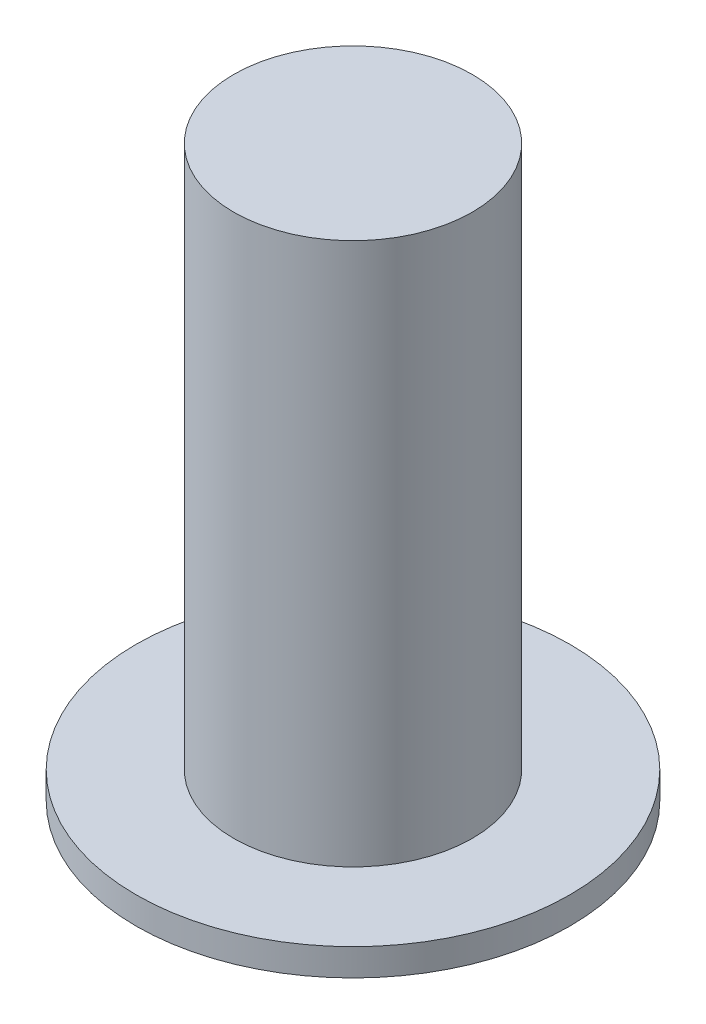
ISO-10303-21;
HEADER;
FILE_DESCRIPTION(('STEP AP214'),'2;1');
FILE_NAME('part.step','',(''),(''),'','','');
FILE_SCHEMA(('AUTOMOTIVE_DESIGN { 1 0 10303 214 1 1 1 1 }'));
ENDSEC;
DATA;
#1=APPLICATION_CONTEXT('core data for automotive mechanical design processes');
#2=APPLICATION_PROTOCOL_DEFINITION('international standard','automotive_design',2000,#1);
#3=PRODUCT_CONTEXT('',#1,'mechanical');
#4=PRODUCT('Part','Part','',(#3));
#5=PRODUCT_RELATED_PRODUCT_CATEGORY('part','',(#4));
#6=PRODUCT_DEFINITION_FORMATION('','',#4);
#7=PRODUCT_DEFINITION_CONTEXT('part definition',#1,'design');
#8=PRODUCT_DEFINITION('design','',#6,#7);
#9=PRODUCT_DEFINITION_SHAPE('','',#8);
#10=(LENGTH_UNIT() NAMED_UNIT(*) SI_UNIT(.MILLI.,.METRE.));
#11=(NAMED_UNIT(*) PLANE_ANGLE_UNIT() SI_UNIT($,.RADIAN.));
#12=(NAMED_UNIT(*) SI_UNIT($,.STERADIAN.) SOLID_ANGLE_UNIT());
#13=UNCERTAINTY_MEASURE_WITH_UNIT(LENGTH_MEASURE(1.E-05),#10,'distance_accuracy_value','');
#14=(GEOMETRIC_REPRESENTATION_CONTEXT(3) GLOBAL_UNCERTAINTY_ASSIGNED_CONTEXT((#13)) GLOBAL_UNIT_ASSIGNED_CONTEXT((#10,
#11,#12)) REPRESENTATION_CONTEXT('',''));
#15=CARTESIAN_POINT('',(0.,0.,0.));
#16=DIRECTION('',(0.,0.,1.));
#17=DIRECTION('',(1.,0.,0.));
#18=AXIS2_PLACEMENT_3D('',#15,#16,#17);
#19=CARTESIAN_POINT('',(0.,100.,0.));
#20=DIRECTION('',(0.,-1.,0.));
#21=DIRECTION('',(0.,0.,-1.));
#22=AXIS2_PLACEMENT_3D('',#19,#20,#21);
#23=CYLINDRICAL_SURFACE('',#22,22.);
#24=CARTESIAN_POINT('',(0.,100.,0.));
#25=DIRECTION('',(0.,1.,0.));
#26=DIRECTION('',(0.,0.,1.));
#27=AXIS2_PLACEMENT_3D('',#24,#25,#26);
#28=CIRCLE('',#27,22.);
#29=CARTESIAN_POINT('',(0.,100.,22.));
#30=VERTEX_POINT('',#29);
#31=EDGE_CURVE('E10',#30,#30,#28,.T.);
#32=ORIENTED_EDGE('',*,*,#31,.F.);
#33=EDGE_LOOP('',(#32));
#34=FACE_BOUND('',#33,.T.);
#35=CARTESIAN_POINT('',(0.,0.,0.));
#36=DIRECTION('',(0.,1.,0.));
#37=DIRECTION('',(0.,0.,1.));
#38=AXIS2_PLACEMENT_3D('',#35,#36,#37);
#39=CIRCLE('',#38,22.);
#40=CARTESIAN_POINT('',(0.,0.,22.));
#41=VERTEX_POINT('',#40);
#42=EDGE_CURVE('E40',#41,#41,#39,.T.);
#43=ORIENTED_EDGE('',*,*,#42,.T.);
#44=EDGE_LOOP('',(#43));
#45=FACE_BOUND('',#44,.T.);
#46=ADVANCED_FACE('F37',(#34,#45),#23,.T.);
#47=CARTESIAN_POINT('',(0.,100.,0.));
#48=DIRECTION('',(0.,1.,0.));
#49=DIRECTION('',(0.,0.,1.));
#50=AXIS2_PLACEMENT_3D('',#47,#48,#49);
#51=PLANE('',#50);
#52=ORIENTED_EDGE('',*,*,#31,.T.);
#53=EDGE_LOOP('',(#52));
#54=FACE_BOUND('',#53,.T.);
#55=ADVANCED_FACE('F72',(#54),#51,.T.);
#56=CARTESIAN_POINT('',(0.,-5.,0.));
#57=DIRECTION('',(0.,1.,0.));
#58=DIRECTION('',(0.,0.,1.));
#59=AXIS2_PLACEMENT_3D('',#56,#57,#58);
#60=CYLINDRICAL_SURFACE('',#59,40.);
#61=CARTESIAN_POINT('',(0.,-5.,0.));
#62=DIRECTION('',(0.,1.,0.));
#63=DIRECTION('',(0.,0.,1.));
#64=AXIS2_PLACEMENT_3D('',#61,#62,#63);
#65=CIRCLE('',#64,40.);
#66=CARTESIAN_POINT('',(0.,-5.,40.));
#67=VERTEX_POINT('',#66);
#68=EDGE_CURVE('E49',#67,#67,#65,.T.);
#69=ORIENTED_EDGE('',*,*,#68,.T.);
#70=EDGE_LOOP('',(#69));
#71=FACE_BOUND('',#70,.T.);
#72=CARTESIAN_POINT('',(0.,0.,0.));
#73=DIRECTION('',(0.,1.,0.));
#74=DIRECTION('',(0.,0.,1.));
#75=AXIS2_PLACEMENT_3D('',#72,#73,#74);
#76=CIRCLE('',#75,40.);
#77=CARTESIAN_POINT('',(0.,0.,40.));
#78=VERTEX_POINT('',#77);
#79=EDGE_CURVE('E51',#78,#78,#76,.T.);
#80=ORIENTED_EDGE('',*,*,#79,.F.);
#81=EDGE_LOOP('',(#80));
#82=FACE_BOUND('',#81,.T.);
#83=ADVANCED_FACE('F59',(#71,#82),#60,.T.);
#84=CARTESIAN_POINT('',(0.,-5.,0.));
#85=DIRECTION('',(0.,1.,0.));
#86=DIRECTION('',(0.,0.,1.));
#87=AXIS2_PLACEMENT_3D('',#84,#85,#86);
#88=PLANE('',#87);
#89=ORIENTED_EDGE('',*,*,#68,.F.);
#90=EDGE_LOOP('',(#89));
#91=FACE_BOUND('',#90,.T.);
#92=ADVANCED_FACE('F62',(#91),#88,.F.);
#93=CARTESIAN_POINT('',(0.,0.,0.));
#94=DIRECTION('',(0.,1.,0.));
#95=DIRECTION('',(0.,0.,1.));
#96=AXIS2_PLACEMENT_3D('',#93,#94,#95);
#97=PLANE('',#96);
#98=ORIENTED_EDGE('',*,*,#42,.F.);
#99=EDGE_LOOP('',(#98));
#100=FACE_BOUND('',#99,.T.);
#101=ORIENTED_EDGE('',*,*,#79,.T.);
#102=EDGE_LOOP('',(#101));
#103=FACE_BOUND('',#102,.T.);
#104=ADVANCED_FACE('F64',(#100,#103),#97,.T.);
#105=CLOSED_SHELL('',(#46,#55,#83,#92,#104));
#106=MANIFOLD_SOLID_BREP('B2',#105);
#107=ADVANCED_BREP_SHAPE_REPRESENTATION('',(#18,#106),#14);
#108=SHAPE_DEFINITION_REPRESENTATION(#9,#107);
ENDSEC;
END-ISO-10303-21;
